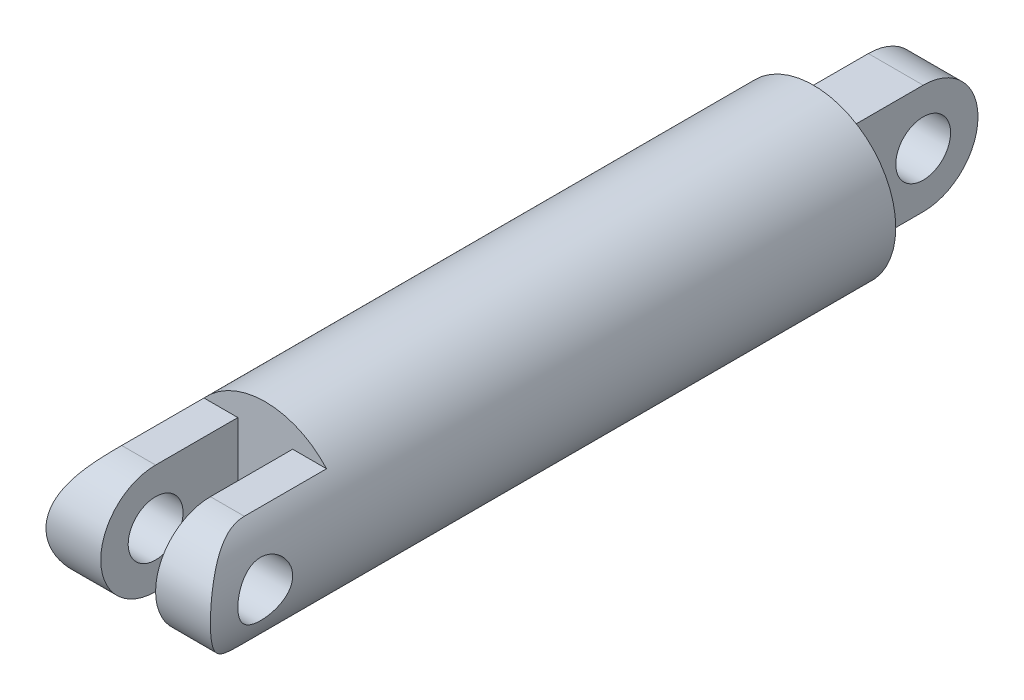
ISO-10303-21;
HEADER;
FILE_DESCRIPTION(('STEP AP214'),'2;1');
FILE_NAME('part.step','',(''),(''),'','','');
FILE_SCHEMA(('AUTOMOTIVE_DESIGN { 1 0 10303 214 1 1 1 1 }'));
ENDSEC;
DATA;
#1=APPLICATION_CONTEXT('core data for automotive mechanical design processes');
#2=APPLICATION_PROTOCOL_DEFINITION('international standard','automotive_design',2000,#1);
#3=PRODUCT_CONTEXT('',#1,'mechanical');
#4=PRODUCT('Part','Part','',(#3));
#5=PRODUCT_RELATED_PRODUCT_CATEGORY('part','',(#4));
#6=PRODUCT_DEFINITION_FORMATION('','',#4);
#7=PRODUCT_DEFINITION_CONTEXT('part definition',#1,'design');
#8=PRODUCT_DEFINITION('design','',#6,#7);
#9=PRODUCT_DEFINITION_SHAPE('','',#8);
#10=(LENGTH_UNIT() NAMED_UNIT(*) SI_UNIT(.MILLI.,.METRE.));
#11=(NAMED_UNIT(*) PLANE_ANGLE_UNIT() SI_UNIT($,.RADIAN.));
#12=(NAMED_UNIT(*) SI_UNIT($,.STERADIAN.) SOLID_ANGLE_UNIT());
#13=UNCERTAINTY_MEASURE_WITH_UNIT(LENGTH_MEASURE(1.E-05),#10,'distance_accuracy_value','');
#14=(GEOMETRIC_REPRESENTATION_CONTEXT(3) GLOBAL_UNCERTAINTY_ASSIGNED_CONTEXT((#13)) GLOBAL_UNIT_ASSIGNED_CONTEXT((#10,
#11,#12)) REPRESENTATION_CONTEXT('',''));
#15=CARTESIAN_POINT('',(0.,0.,0.));
#16=DIRECTION('',(0.,0.,1.));
#17=DIRECTION('',(1.,0.,0.));
#18=AXIS2_PLACEMENT_3D('',#15,#16,#17);
#19=CARTESIAN_POINT('',(-7.5,5.00000000000001,0.));
#20=DIRECTION('',(0.,1.,0.));
#21=DIRECTION('',(0.,0.,1.));
#22=AXIS2_PLACEMENT_3D('',#19,#20,#21);
#23=PLANE('',#22);
#24=DIRECTION('',(0.,0.,-1.));
#25=VECTOR('',#24,1.);
#26=CARTESIAN_POINT('',(-5.59016994374948,5.,62.5));
#27=LINE('',#26,#25);
#28=CARTESIAN_POINT('',(-5.59016994374948,5.,57.5));
#29=VERTEX_POINT('',#28);
#30=CARTESIAN_POINT('',(-5.59016994374947,5.,50.));
#31=VERTEX_POINT('',#30);
#32=EDGE_CURVE('E199',#29,#31,#27,.T.);
#33=ORIENTED_EDGE('',*,*,#32,.F.);
#34=DIRECTION('',(1.,0.,0.));
#35=VECTOR('',#34,1.);
#36=CARTESIAN_POINT('',(-7.5,5.,57.5));
#37=LINE('',#36,#35);
#38=CARTESIAN_POINT('',(-2.5,5.,57.5));
#39=VERTEX_POINT('',#38);
#40=EDGE_CURVE('E238',#29,#39,#37,.T.);
#41=ORIENTED_EDGE('',*,*,#40,.T.);
#42=DIRECTION('',(0.,0.,-1.));
#43=VECTOR('',#42,1.);
#44=CARTESIAN_POINT('',(-2.5,5.,62.5));
#45=LINE('',#44,#43);
#46=CARTESIAN_POINT('',(-2.5,5.,50.));
#47=VERTEX_POINT('',#46);
#48=EDGE_CURVE('E388',#39,#47,#45,.T.);
#49=ORIENTED_EDGE('',*,*,#48,.T.);
#50=DIRECTION('',(1.,0.,0.));
#51=VECTOR('',#50,1.);
#52=CARTESIAN_POINT('',(-7.5,5.,50.));
#53=LINE('',#52,#51);
#54=EDGE_CURVE('E211',#31,#47,#53,.T.);
#55=ORIENTED_EDGE('',*,*,#54,.F.);
#56=EDGE_LOOP('',(#33,#41,#49,#55));
#57=FACE_BOUND('',#56,.T.);
#58=ADVANCED_FACE('F100',(#57),#23,.T.);
#59=CARTESIAN_POINT('',(-7.5,-4.99999999999999,0.));
#60=DIRECTION('',(0.,1.,0.));
#61=DIRECTION('',(0.,0.,1.));
#62=AXIS2_PLACEMENT_3D('',#59,#60,#61);
#63=PLANE('',#62);
#64=DIRECTION('',(1.,0.,0.));
#65=VECTOR('',#64,1.);
#66=CARTESIAN_POINT('',(-7.5,-5.,57.5));
#67=LINE('',#66,#65);
#68=CARTESIAN_POINT('',(-5.59016994374947,-5.,57.5));
#69=VERTEX_POINT('',#68);
#70=CARTESIAN_POINT('',(-2.5,-5.,57.5));
#71=VERTEX_POINT('',#70);
#72=EDGE_CURVE('E234',#69,#71,#67,.T.);
#73=ORIENTED_EDGE('',*,*,#72,.F.);
#74=DIRECTION('',(0.,0.,-1.));
#75=VECTOR('',#74,1.);
#76=CARTESIAN_POINT('',(-5.59016994374947,-5.,62.5));
#77=LINE('',#76,#75);
#78=CARTESIAN_POINT('',(-5.59016994374947,-5.,50.));
#79=VERTEX_POINT('',#78);
#80=EDGE_CURVE('E422',#69,#79,#77,.T.);
#81=ORIENTED_EDGE('',*,*,#80,.T.);
#82=DIRECTION('',(1.,0.,0.));
#83=VECTOR('',#82,1.);
#84=CARTESIAN_POINT('',(-7.5,-5.,50.));
#85=LINE('',#84,#83);
#86=CARTESIAN_POINT('',(-2.5,-5.,50.));
#87=VERTEX_POINT('',#86);
#88=EDGE_CURVE('E212',#79,#87,#85,.T.);
#89=ORIENTED_EDGE('',*,*,#88,.T.);
#90=DIRECTION('',(0.,0.,-1.));
#91=VECTOR('',#90,1.);
#92=CARTESIAN_POINT('',(-2.5,-5.,62.5));
#93=LINE('',#92,#91);
#94=EDGE_CURVE('E385',#71,#87,#93,.T.);
#95=ORIENTED_EDGE('',*,*,#94,.F.);
#96=EDGE_LOOP('',(#73,#81,#89,#95));
#97=FACE_BOUND('',#96,.T.);
#98=ADVANCED_FACE('F292',(#97),#63,.F.);
#99=CARTESIAN_POINT('',(-7.5,0.,57.5));
#100=DIRECTION('',(1.,0.,0.));
#101=DIRECTION('',(0.,0.,-1.));
#102=AXIS2_PLACEMENT_3D('',#99,#100,#101);
#103=CYLINDRICAL_SURFACE('',#102,2.50000000000001);
#104=CARTESIAN_POINT('',(-7.5,0.,55.));
#105=CARTESIAN_POINT('',(-7.5000003825236,-0.13640840721681,54.9999993656709));
#106=CARTESIAN_POINT('',(-7.49624423768862,-0.272812986346377,55.011200665318));
#107=CARTESIAN_POINT('',(-7.48163025508202,-0.541604402182434,55.055572772043));
#108=CARTESIAN_POINT('',(-7.47077168005381,-0.673990820297049,55.0887458598723));
#109=CARTESIAN_POINT('',(-7.44313269766106,-0.930831973754445,55.1757981084601));
#110=CARTESIAN_POINT('',(-7.42636219327133,-1.05529956471509,55.2296426561482));
#111=CARTESIAN_POINT('',(-7.38861114293354,-1.29343734201332,55.3563529320959));
#112=CARTESIAN_POINT('',(-7.36762976669445,-1.40710539239677,55.4292224125065));
#113=CARTESIAN_POINT('',(-7.32285236107512,-1.62435418755567,55.5945645121469));
#114=CARTESIAN_POINT('',(-7.29898891159462,-1.72750925074578,55.6875780856512));
#115=CARTESIAN_POINT('',(-7.25150786957803,-1.91708173175522,55.8894178867664));
#116=CARTESIAN_POINT('',(-7.22789033226372,-2.00349546372367,55.9982475873213));
#117=CARTESIAN_POINT('',(-7.18283331193184,-2.15956235556966,56.2324627879911));
#118=CARTESIAN_POINT('',(-7.1614759818922,-2.22866214555259,56.3582343493303));
#119=CARTESIAN_POINT('',(-7.12438263546503,-2.34454718469431,56.6204402361464));
#120=CARTESIAN_POINT('',(-7.10864490401864,-2.39133924346692,56.7568712929069));
#121=CARTESIAN_POINT('',(-7.08528258173443,-2.45968365377292,57.0316830537418));
#122=CARTESIAN_POINT('',(-7.07740239424028,-2.48203362067943,57.1698430212227));
#123=CARTESIAN_POINT('',(-7.06989141573768,-2.5033528083362,57.4481593853897));
#124=CARTESIAN_POINT('',(-7.07025807556824,-2.50232925401181,57.588315151773));
#125=CARTESIAN_POINT('',(-7.0789753752045,-2.47754975925856,57.8598415761101));
#126=CARTESIAN_POINT('',(-7.08696039668832,-2.4548347829175,57.9913210072976));
#127=CARTESIAN_POINT('',(-7.10941644311377,-2.38901540712355,58.2484835490171));
#128=CARTESIAN_POINT('',(-7.12388824460269,-2.34590856647969,58.3741659635877));
#129=CARTESIAN_POINT('',(-7.15794777828122,-2.23984764515054,58.6185318739787));
#130=CARTESIAN_POINT('',(-7.17761414482793,-2.17658512176817,58.7370700636738));
#131=CARTESIAN_POINT('',(-7.21981396439315,-2.03222276575786,58.9621772706993));
#132=CARTESIAN_POINT('',(-7.24234824476158,-1.95111778091003,59.0687428173335));
#133=CARTESIAN_POINT('',(-7.28918322919352,-1.76837333170561,59.2727289954019));
#134=CARTESIAN_POINT('',(-7.31351473387107,-1.6658828751908,59.3693817362727));
#135=CARTESIAN_POINT('',(-7.36017345967591,-1.44584892492518,59.5443281666585));
#136=CARTESIAN_POINT('',(-7.38250048845168,-1.32830398915205,59.6226200954112));
#137=CARTESIAN_POINT('',(-7.42292769844484,-1.07986903261568,59.7592407505877));
#138=CARTESIAN_POINT('',(-7.44098375020098,-0.948858191040853,59.8173637283518));
#139=CARTESIAN_POINT('',(-7.47051417861087,-0.67817270841128,59.9105079348893));
#140=CARTESIAN_POINT('',(-7.48199084137198,-0.538501095387393,59.9455371885586));
#141=CARTESIAN_POINT('',(-7.49669067678601,-0.260959573823266,59.9901391650559));
#142=CARTESIAN_POINT('',(-7.5002500458432,-0.123273999662121,60.0007495229319));
#143=CARTESIAN_POINT('',(-7.49972256737068,0.151937674900589,59.9991683160038));
#144=CARTESIAN_POINT('',(-7.49563701048406,0.289463798299123,59.9869806000503));
#145=CARTESIAN_POINT('',(-7.48050061792761,0.556299665760638,59.9409702306601));
#146=CARTESIAN_POINT('',(-7.46965496777981,0.685732017087109,59.9077844848763));
#147=CARTESIAN_POINT('',(-7.44229617075175,0.937139896448934,59.8215163888332));
#148=CARTESIAN_POINT('',(-7.42578230116688,1.05911447127152,59.7684315013305));
#149=CARTESIAN_POINT('',(-7.38822328218224,1.29572074098318,59.642323920398));
#150=CARTESIAN_POINT('',(-7.36707036889465,1.41007489804287,59.5688135167921));
#151=CARTESIAN_POINT('',(-7.32263134790656,1.62516207533897,59.4045146249663));
#152=CARTESIAN_POINT('',(-7.29934458984569,1.72589091948894,59.3137208599206));
#153=CARTESIAN_POINT('',(-7.25192119951112,1.91563126951575,59.1125531224835));
#154=CARTESIAN_POINT('',(-7.2277940271857,2.00390242311443,59.0014769326828));
#155=CARTESIAN_POINT('',(-7.18249933236772,2.16064380580894,58.7655710804728));
#156=CARTESIAN_POINT('',(-7.16133183455005,2.22911386982754,58.6407413034148));
#157=CARTESIAN_POINT('',(-7.12455979478459,2.34399232604091,58.3808174617753));
#158=CARTESIAN_POINT('',(-7.10894401982447,2.39044533041256,58.2457448020781));
#159=CARTESIAN_POINT('',(-7.08527080766124,2.4597366668984,57.9690533748897));
#160=CARTESIAN_POINT('',(-7.07720996559098,2.48258563738486,57.8274375864891));
#161=CARTESIAN_POINT('',(-7.06994647185443,2.50319070619336,57.5495072598977));
#162=CARTESIAN_POINT('',(-7.07031000643537,2.50217564327101,57.4132941492829));
#163=CARTESIAN_POINT('',(-7.07878174559668,2.47810573362174,57.1430873126948));
#164=CARTESIAN_POINT('',(-7.08688948923404,2.45505219864647,57.0090934551123));
#165=CARTESIAN_POINT('',(-7.10961310762229,2.38842953282337,56.7496608424938));
#166=CARTESIAN_POINT('',(-7.12410245056194,2.34525836503879,56.6241079374888));
#167=CARTESIAN_POINT('',(-7.15790997046171,2.23994841439937,56.3819314826543));
#168=CARTESIAN_POINT('',(-7.17722921908483,2.17780542138452,56.26530992203));
#169=CARTESIAN_POINT('',(-7.21957073065115,2.03315173145858,56.0387908251927));
#170=CARTESIAN_POINT('',(-7.24271779105342,1.94987060691146,55.929408745254));
#171=CARTESIAN_POINT('',(-7.28958390708132,1.76660720783913,55.7257754665395));
#172=CARTESIAN_POINT('',(-7.3133031228093,1.66662021112872,55.6315285607798));
#173=CARTESIAN_POINT('',(-7.3597507631386,1.44810389230173,55.4571389692771));
#174=CARTESIAN_POINT('',(-7.38240454503141,1.32900378374932,55.3776891306225));
#175=CARTESIAN_POINT('',(-7.4231497793153,1.07839339351656,55.2400239278734));
#176=CARTESIAN_POINT('',(-7.44124239769824,0.946886295330871,55.1818031351949));
#177=CARTESIAN_POINT('',(-7.47013787671355,0.681234118002439,55.0906959187783));
#178=CARTESIAN_POINT('',(-7.48123031056307,0.547469394191021,55.0567938343416));
#179=CARTESIAN_POINT('',(-7.49616017660554,0.275801040025616,55.0114492983072));
#180=CARTESIAN_POINT('',(-7.49999961329762,0.137898563921864,55.0000006412587));
#181=CARTESIAN_POINT('',(-7.5,0.,55.));
#182=B_SPLINE_CURVE_WITH_KNOTS('',3,(#104,#105,#106,#107,#108,#109,#110,#111,#112,#113,#114,
#115,#116,#117,#118,#119,#120,#121,#122,#123,#124,#125,#126,#127,#128,#129,#130,#131,#132,#133,
#134,#135,#136,#137,#138,#139,#140,#141,#142,#143,#144,#145,#146,#147,#148,#149,#150,#151,#152,
#153,#154,#155,#156,#157,#158,#159,#160,#161,#162,#163,#164,#165,#166,#167,#168,#169,#170,#171,
#172,#173,#174,#175,#176,#177,#178,#179,#180,#181),.UNSPECIFIED.,.T.,.F.,(4,2,2,2,2,2,2,2,2,2,2,
2,2,2,2,2,2,2,2,2,2,2,2,2,2,2,2,2,2,2,2,2,2,2,2,2,2,2,4),(0.,0.408717765065028,
0.817477963168803,1.22555668217569,1.63371594449776,2.05461710706891,2.47561083218827,
2.90870962058677,3.34167611732084,3.76004814354601,4.17829084968715,4.57742066378203,
4.97659827138706,5.38220427887828,5.78792756395519,6.21483264528417,6.64177864916548,
7.07296014125896,7.50399172193023,7.91633957937926,8.32861782910444,8.72895394945537,
9.12934113210263,9.54025999609345,9.95130452054731,10.3810255720188,10.810750205875,
11.2396003456693,11.668257117646,12.0748916516065,12.4815019837844,12.8803896770105,
13.2793659543995,13.6957516672952,14.1122552780945,14.5449915208776,14.9776170288115,
15.3909139593454,15.8040966509536),.UNSPECIFIED.);
#183=CARTESIAN_POINT('',(-7.5,0.,55.));
#184=VERTEX_POINT('',#183);
#185=EDGE_CURVE('E362',#184,#184,#182,.T.);
#186=ORIENTED_EDGE('',*,*,#185,.T.);
#187=EDGE_LOOP('',(#186));
#188=FACE_BOUND('',#187,.T.);
#189=CARTESIAN_POINT('',(-2.5,0.,57.5));
#190=DIRECTION('',(1.,0.,0.));
#191=DIRECTION('',(0.,1.,0.));
#192=AXIS2_PLACEMENT_3D('',#189,#190,#191);
#193=CIRCLE('',#192,2.50000000000001);
#194=CARTESIAN_POINT('',(-2.5,2.50000000000001,57.5));
#195=VERTEX_POINT('',#194);
#196=EDGE_CURVE('E231',#195,#195,#193,.F.);
#197=ORIENTED_EDGE('',*,*,#196,.F.);
#198=EDGE_LOOP('',(#197));
#199=FACE_BOUND('',#198,.T.);
#200=ADVANCED_FACE('F298',(#188,#199),#103,.F.);
#201=CARTESIAN_POINT('',(-7.5,0.,57.5));
#202=DIRECTION('',(1.,0.,0.));
#203=DIRECTION('',(0.,0.,-1.));
#204=AXIS2_PLACEMENT_3D('',#201,#202,#203);
#205=CYLINDRICAL_SURFACE('',#204,5.);
#206=CARTESIAN_POINT('',(-5.59016994374947,-5.,57.5));
#207=CARTESIAN_POINT('',(-5.59010226361799,-5.00003201559916,57.6229128319572));
#208=CARTESIAN_POINT('',(-5.59422195484826,-4.99546916272249,57.7457835039495));
#209=CARTESIAN_POINT('',(-5.61031529203818,-4.97741130258459,57.9901889706824));
#210=CARTESIAN_POINT('',(-5.62227841275833,-4.96392826525997,58.1117253340456));
#211=CARTESIAN_POINT('',(-5.65338604571233,-4.92846233533554,58.3513567436878));
#212=CARTESIAN_POINT('',(-5.67245848399497,-4.90656468311768,58.4694739200321));
#213=CARTESIAN_POINT('',(-5.7169359163873,-4.85466962385897,58.7026920062733));
#214=CARTESIAN_POINT('',(-5.74234275220442,-4.82466986094175,58.8177920281665));
#215=CARTESIAN_POINT('',(-5.82632128684178,-4.72351818053447,59.1563803841529));
#216=CARTESIAN_POINT('',(-5.89285893571061,-4.64099224020302,59.3746007478263));
#217=CARTESIAN_POINT('',(-6.03939263101204,-4.44863770598509,59.7941675176117));
#218=CARTESIAN_POINT('',(-6.11942668598134,-4.33873157480712,59.9954637936456));
#219=CARTESIAN_POINT('',(-6.29868579922378,-4.07500623960727,60.4091852347824));
#220=CARTESIAN_POINT('',(-6.39896579342898,-3.91702659837082,60.6185281312344));
#221=CARTESIAN_POINT('',(-6.54873658541254,-3.65706476808987,60.9121827044888));
#222=CARTESIAN_POINT('',(-6.59857754919796,-3.56652606748559,61.0067178110933));
#223=CARTESIAN_POINT('',(-6.69707992879728,-3.37793159469755,61.1887326804366));
#224=CARTESIAN_POINT('',(-6.74574111230676,-3.27987435764812,61.2762110614383));
#225=CARTESIAN_POINT('',(-6.84779398342079,-3.06173982813814,61.4558194920628));
#226=CARTESIAN_POINT('',(-6.90084497500896,-2.94053369616544,61.5467770351006));
#227=CARTESIAN_POINT('',(-7.00262930329851,-2.68915572684724,61.7180034828374));
#228=CARTESIAN_POINT('',(-7.05136448408698,-2.55898776144359,61.7982769601382));
#229=CARTESIAN_POINT('',(-7.14313102894779,-2.29037273054282,61.9472191864513));
#230=CARTESIAN_POINT('',(-7.18616630635346,-2.15193144095229,62.0158959063485));
#231=CARTESIAN_POINT('',(-7.26524703275327,-1.86760242661746,62.1407054007236));
#232=CARTESIAN_POINT('',(-7.301294394784,-1.72171675372871,62.1968416089797));
#233=CARTESIAN_POINT('',(-7.36005121285871,-1.44775400626075,62.2876242904999));
#234=CARTESIAN_POINT('',(-7.38397414568696,-1.32059901489015,62.3242764081429));
#235=CARTESIAN_POINT('',(-7.42546096608191,-1.06280856138209,62.3875395048978));
#236=CARTESIAN_POINT('',(-7.44302609052533,-0.932173781533196,62.4141524371205));
#237=CARTESIAN_POINT('',(-7.47131644326015,-0.668571926042403,62.4568968080757));
#238=CARTESIAN_POINT('',(-7.48204706115876,-0.535606773344601,62.4730365060606));
#239=CARTESIAN_POINT('',(-7.49638849316886,-0.268425779014243,62.494587666984));
#240=CARTESIAN_POINT('',(-7.49999959021819,-0.134209987296497,62.499999556258));
#241=CARTESIAN_POINT('',(-7.50000038348696,0.125598011271417,62.500000415268));
#242=CARTESIAN_POINT('',(-7.49683859322069,0.251190939137055,62.4952615856888));
#243=CARTESIAN_POINT('',(-7.48426981875016,0.501398424402497,62.4763786631053));
#244=CARTESIAN_POINT('',(-7.47486055383152,0.626012607683884,62.4622311353418));
#245=CARTESIAN_POINT('',(-7.45002835224819,0.873217578657856,62.424745594317));
#246=CARTESIAN_POINT('',(-7.43460628603808,0.995808656552775,62.4014089113364));
#247=CARTESIAN_POINT('',(-7.39810821970811,1.23815204074688,62.3458686372065));
#248=CARTESIAN_POINT('',(-7.37702981954413,1.3579031184732,62.313661281981));
#249=CARTESIAN_POINT('',(-7.32981543670939,1.59314805421769,62.2409866655272));
#250=CARTESIAN_POINT('',(-7.30370586592719,1.70866054959293,62.2005624815031));
#251=CARTESIAN_POINT('',(-7.24690745085558,1.93546515133163,62.1118135788698));
#252=CARTESIAN_POINT('',(-7.21621682334522,2.04675559296785,62.0634857829988));
#253=CARTESIAN_POINT('',(-7.11817940386788,2.3734106060806,61.9073892515922));
#254=CARTESIAN_POINT('',(-7.04482545719646,2.58175844053806,61.7884447379015));
#255=CARTESIAN_POINT('',(-6.8806780561988,2.99324792707627,61.5133461626331));
#256=CARTESIAN_POINT('',(-6.78893289097235,3.1944471625288,61.354890934673));
#257=CARTESIAN_POINT('',(-6.59954115495232,3.56933599975951,61.010652999138));
#258=CARTESIAN_POINT('',(-6.50188643365823,3.74298635364909,60.8248320180691));
#259=CARTESIAN_POINT('',(-6.34920531525177,3.99364730435712,60.5120388092103));
#260=CARTESIAN_POINT('',(-6.29353108665728,4.08057745182287,60.3932023698115));
#261=CARTESIAN_POINT('',(-6.18446883282753,4.24405575434584,60.1475991963711));
#262=CARTESIAN_POINT('',(-6.13108134934901,4.32060145841404,60.0208306004227));
#263=CARTESIAN_POINT('',(-5.97718524795149,4.53362867574809,59.6293787287551));
#264=CARTESIAN_POINT('',(-5.88265325211255,4.65395289499761,59.3529883676076));
#265=CARTESIAN_POINT('',(-5.7489446861421,4.81742525619265,58.8564514499051));
#266=CARTESIAN_POINT('',(-5.70167352841641,4.87277745975599,58.6425223787687));
#267=CARTESIAN_POINT('',(-5.64825621036596,4.93435877253254,58.3151302386967));
#268=CARTESIAN_POINT('',(-5.63337185075142,4.95130477197473,58.2050358886755));
#269=CARTESIAN_POINT('',(-5.60994599745737,4.97783435274302,57.9833227586418));
#270=CARTESIAN_POINT('',(-5.60140045262999,4.98742263653384,57.8717049987824));
#271=CARTESIAN_POINT('',(-5.59419461342581,4.99549713342325,57.7165365389982));
#272=CARTESIAN_POINT('',(-5.59268623376651,4.9971854695902,57.6732518929225));
#273=CARTESIAN_POINT('',(-5.5906740558166,4.99943659388596,57.5866467828403));
#274=CARTESIAN_POINT('',(-5.5901698695008,4.99999981676426,57.5433263391419));
#275=CARTESIAN_POINT('',(-5.59016994374948,5.,57.5));
#276=B_SPLINE_CURVE_WITH_KNOTS('',3,(#206,#207,#208,#209,#210,#211,#212,#213,#214,#215,#216,
#217,#218,#219,#220,#221,#222,#223,#224,#225,#226,#227,#228,#229,#230,#231,#232,#233,#234,#235,
#236,#237,#238,#239,#240,#241,#242,#243,#244,#245,#246,#247,#248,#249,#250,#251,#252,#253,#254,
#255,#256,#257,#258,#259,#260,#261,#262,#263,#264,#265,#266,#267,#268,#269,#270,#271,#272,#273,
#274,#275),.UNSPECIFIED.,.F.,.F.,(4,2,2,2,2,2,2,2,2,2,2,2,2,2,2,2,2,2,2,2,2,2,2,2,2,2,2,2,2,2,2,
2,2,2,4),(0.,0.368516864311458,0.736540218576852,1.10092978285455,1.46542541612836,
2.19004710441291,2.91674463344916,3.75566981477297,4.17556623857454,4.59554468133307,
5.07657717444378,5.55740312708243,6.03789723281714,6.51825961043194,6.92115592840717,
7.32397382293358,7.72647366566694,8.12895751227685,8.50561480672542,8.88240968002327,
9.25915002614016,9.63605048074902,10.0110237417354,10.3861433472097,11.1357498247009,
11.9489727394519,12.7633440160795,13.2350651665194,13.7068974619908,14.6482604078241,
15.3232302822239,15.6600060261307,15.9965663501729,16.1265773111982,16.2565380256032),.UNSPECIFIED.);
#277=EDGE_CURVE('E357',#69,#29,#276,.T.);
#278=ORIENTED_EDGE('',*,*,#277,.F.);
#279=ORIENTED_EDGE('',*,*,#72,.T.);
#280=CARTESIAN_POINT('',(-2.5,0.,57.5));
#281=DIRECTION('',(1.,0.,0.));
#282=DIRECTION('',(0.,1.,0.));
#283=AXIS2_PLACEMENT_3D('',#280,#281,#282);
#284=CIRCLE('',#283,5.);
#285=EDGE_CURVE('E12',#71,#39,#284,.F.);
#286=ORIENTED_EDGE('',*,*,#285,.T.);
#287=ORIENTED_EDGE('',*,*,#40,.F.);
#288=EDGE_LOOP('',(#278,#279,#286,#287));
#289=FACE_BOUND('',#288,.T.);
#290=ADVANCED_FACE('F340',(#289),#205,.T.);
#291=CARTESIAN_POINT('',(5.59016994374948,5.,57.5));
#292=CARTESIAN_POINT('',(5.59010226445732,5.00003201517393,57.622912460547));
#293=CARTESIAN_POINT('',(5.59422193038262,4.99546919008054,57.7457827613626));
#294=CARTESIAN_POINT('',(5.61031517101094,4.97741143868822,57.9901874982554));
#295=CARTESIAN_POINT('',(5.62227822063732,4.96392848213943,58.1117235029259));
#296=CARTESIAN_POINT('',(5.65338576619382,4.92846265601991,58.3513549396555));
#297=CARTESIAN_POINT('',(5.67245823203861,4.90656497492185,58.4694724882314));
#298=CARTESIAN_POINT('',(5.71693576125672,4.85466980704325,58.7026913035797));
#299=CARTESIAN_POINT('',(5.74234266641994,4.82466996428155,58.8177916823098));
#300=CARTESIAN_POINT('',(5.82632124311297,4.72351823318001,59.1563802078195));
#301=CARTESIAN_POINT('',(5.89285883142751,4.64099236942275,59.3746004058546));
#302=CARTESIAN_POINT('',(6.03939250499645,4.44863787909013,59.7941672005125));
#303=CARTESIAN_POINT('',(6.11942661962652,4.33873167274042,59.9954636395924));
#304=CARTESIAN_POINT('',(6.29868730837299,4.07500401899203,60.4091887188764));
#305=CARTESIAN_POINT('',(6.39896894668939,3.9170216297286,60.6185347191776));
#306=CARTESIAN_POINT('',(6.54874052957501,3.65705766842246,60.9121902361376));
#307=CARTESIAN_POINT('',(6.59858071272888,3.56652016600152,61.0067237355512));
#308=CARTESIAN_POINT('',(6.69708150444303,3.37792842268575,61.1887355129615));
#309=CARTESIAN_POINT('',(6.74574188183287,3.2798727240983,61.2762124159831));
#310=CARTESIAN_POINT('',(6.8477870780144,3.0617545752834,61.4558073386156));
#311=CARTESIAN_POINT('',(6.90083152907612,2.94056436511528,61.5467539806611));
#312=CARTESIAN_POINT('',(7.0026042051056,2.68922024819486,61.7179616960362));
#313=CARTESIAN_POINT('',(7.0513342575425,2.55907017853796,61.7982273008976));
#314=CARTESIAN_POINT('',(7.1431024211524,2.29046251931499,61.9471733546342));
#315=CARTESIAN_POINT('',(7.18614320859165,2.15200888067943,62.015859254894));
#316=CARTESIAN_POINT('',(7.26523573466908,1.86764864764788,62.1406877668306));
#317=CARTESIAN_POINT('',(7.30128897098523,1.72174365882795,62.1968330667933));
#318=CARTESIAN_POINT('',(7.3616269212467,1.44040558765596,62.290058995005));
#319=CARTESIAN_POINT('',(7.38677785041693,1.30563224903165,62.3285712695995));
#320=CARTESIAN_POINT('',(7.42991277845054,1.03224687814789,62.3943049093148));
#321=CARTESIAN_POINT('',(7.44789818123794,0.893635603543305,62.4215284862451));
#322=CARTESIAN_POINT('',(7.47614707065181,0.613969581475909,62.4641746575667));
#323=CARTESIAN_POINT('',(7.48641820157216,0.472917394995508,62.479608934573));
#324=CARTESIAN_POINT('',(7.49894085913111,0.189663788364084,62.4984162296433));
#325=CARTESIAN_POINT('',(7.50119351729107,0.0474625332018543,62.5017909494837));
#326=CARTESIAN_POINT('',(7.49788711574803,-0.214926346569336,62.496830020676));
#327=CARTESIAN_POINT('',(7.4934665190527,-0.335165287104258,62.4902010668775));
#328=CARTESIAN_POINT('',(7.47892220337967,-0.574546724821544,62.4683341695846));
#329=CARTESIAN_POINT('',(7.46879681536646,-0.693688890751088,62.4530937066402));
#330=CARTESIAN_POINT('',(7.44307060770358,-0.929952068596904,62.41421545244));
#331=CARTESIAN_POINT('',(7.4274716519369,-1.04707375430986,62.3905805196721));
#332=CARTESIAN_POINT('',(7.39114067829175,-1.27859359703581,62.3352238886201));
#333=CARTESIAN_POINT('',(7.3704066699432,-1.39299067903352,62.3034990543537));
#334=CARTESIAN_POINT('',(7.30131486800451,-1.73005536090665,62.1970368204148));
#335=CARTESIAN_POINT('',(7.24593119108564,-1.94778788254665,62.1108108780934));
#336=CARTESIAN_POINT('',(7.12052339554367,-2.36556147420187,61.9111078414692));
#337=CARTESIAN_POINT('',(7.05049660175356,-2.56559930203851,61.7976257671501));
#338=CARTESIAN_POINT('',(6.89045516040976,-2.97069678505628,61.5300582038286));
#339=CARTESIAN_POINT('',(6.79902315170023,-3.17296135211842,61.3725965512661));
#340=CARTESIAN_POINT('',(6.60999664050786,-3.54999843902834,61.0302280428355));
#341=CARTESIAN_POINT('',(6.51239293717769,-3.72472848819274,60.8452796273609));
#342=CARTESIAN_POINT('',(6.35968320603837,-3.97694874366429,60.534037396458));
#343=CARTESIAN_POINT('',(6.30402476438211,-4.06435760393837,60.4159275647113));
#344=CARTESIAN_POINT('',(6.19487641908603,-4.22886066252285,60.1717849187943));
#345=CARTESIAN_POINT('',(6.14138702460645,-4.30595244866985,60.0457502618648));
#346=CARTESIAN_POINT('',(5.98697032359011,-4.52074303081129,59.6565033029641));
#347=CARTESIAN_POINT('',(5.89181010067388,-4.64240418228592,59.3815997545078));
#348=CARTESIAN_POINT('',(5.75614663097742,-4.80884917205035,58.8865984083301));
#349=CARTESIAN_POINT('',(5.70780007382718,-4.8656199042536,58.6727015563252));
#350=CARTESIAN_POINT('',(5.65266631753014,-4.92931127660652,58.3451417833851));
#351=CARTESIAN_POINT('',(5.63719320237259,-4.94695700785962,58.2349547615092));
#352=CARTESIAN_POINT('',(5.61257721152858,-4.97487072846233,58.0129772887609));
#353=CARTESIAN_POINT('',(5.6034303802061,-4.98514332816252,57.9011878845304));
#354=CARTESIAN_POINT('',(5.59515338026079,-4.99442370748282,57.7409520259264));
#355=CARTESIAN_POINT('',(5.59328601743422,-4.99651432568549,57.6927963539451));
#356=CARTESIAN_POINT('',(5.59079425464031,-4.99930222265414,57.5964293939127));
#357=CARTESIAN_POINT('',(5.59016942249225,-4.9999999858874,57.5482181310375));
#358=CARTESIAN_POINT('',(5.59016994374947,-5.,57.5));
#359=B_SPLINE_CURVE_WITH_KNOTS('',3,(#291,#292,#293,#294,#295,#296,#297,#298,#299,#300,#301,
#302,#303,#304,#305,#306,#307,#308,#309,#310,#311,#312,#313,#314,#315,#316,#317,#318,#319,#320,
#321,#322,#323,#324,#325,#326,#327,#328,#329,#330,#331,#332,#333,#334,#335,#336,#337,#338,#339,
#340,#341,#342,#343,#344,#345,#346,#347,#348,#349,#350,#351,#352,#353,#354,#355,#356,#357,#358),
.UNSPECIFIED.,.F.,.F.,(4,2,2,2,2,2,2,2,2,2,2,2,2,2,2,2,2,2,2,2,2,2,2,2,2,2,2,2,2,2,2,2,2,4),(0.,
0.36851575171752,0.736537999625394,1.10092867135667,1.46542541646112,2.19004653621929,
2.91674463400917,3.75568298357548,4.1755730100087,4.59554465521631,5.07651617741289,
5.55728298782238,6.03782283148632,6.51825956437982,6.94483626061025,7.37132933756313,
7.79739923062861,8.22340899674542,8.58447831828017,8.94565333179428,9.30670547559305,
9.66789779154569,10.3866775595137,11.1055887570481,11.9189816837108,12.7336172025118,
13.2044776085119,13.6754479114957,14.6151291766078,15.2917554506692,15.6293636463715,
15.9667605544628,16.1114425917876,16.2560742965681),.UNSPECIFIED.);
#360=CARTESIAN_POINT('',(5.59016994374948,5.,57.5));
#361=VERTEX_POINT('',#360);
#362=CARTESIAN_POINT('',(5.59016994374947,-5.,57.5));
#363=VERTEX_POINT('',#362);
#364=EDGE_CURVE('E115',#361,#363,#359,.T.);
#365=ORIENTED_EDGE('',*,*,#364,.F.);
#366=CARTESIAN_POINT('',(2.5,5.,57.5));
#367=VERTEX_POINT('',#366);
#368=EDGE_CURVE('E197',#367,#361,#37,.T.);
#369=ORIENTED_EDGE('',*,*,#368,.F.);
#370=CARTESIAN_POINT('',(2.5,0.,57.5));
#371=DIRECTION('',(1.,0.,0.));
#372=DIRECTION('',(0.,1.,0.));
#373=AXIS2_PLACEMENT_3D('',#370,#371,#372);
#374=CIRCLE('',#373,5.);
#375=CARTESIAN_POINT('',(2.5,-5.,57.5));
#376=VERTEX_POINT('',#375);
#377=EDGE_CURVE('E108',#376,#367,#374,.F.);
#378=ORIENTED_EDGE('',*,*,#377,.F.);
#379=EDGE_CURVE('E237',#376,#363,#67,.T.);
#380=ORIENTED_EDGE('',*,*,#379,.T.);
#381=EDGE_LOOP('',(#365,#369,#378,#380));
#382=FACE_BOUND('',#381,.T.);
#383=ADVANCED_FACE('F335',(#382),#205,.T.);
#384=CARTESIAN_POINT('',(2.5,5.,-12.5));
#385=DIRECTION('',(-1.,0.,0.));
#386=DIRECTION('',(0.,-1.,0.));
#387=AXIS2_PLACEMENT_3D('',#384,#385,#386);
#388=PLANE('',#387);
#389=CARTESIAN_POINT('',(2.5,0.,-7.5));
#390=DIRECTION('',(-1.,0.,0.));
#391=DIRECTION('',(0.,-1.,0.));
#392=AXIS2_PLACEMENT_3D('',#389,#390,#391);
#393=CIRCLE('',#392,2.5);
#394=CARTESIAN_POINT('',(2.5,-2.5,-7.5));
#395=VERTEX_POINT('',#394);
#396=EDGE_CURVE('E242',#395,#395,#393,.T.);
#397=ORIENTED_EDGE('',*,*,#396,.T.);
#398=EDGE_LOOP('',(#397));
#399=FACE_BOUND('',#398,.T.);
#400=CARTESIAN_POINT('',(2.5,0.,-7.5));
#401=DIRECTION('',(-1.,0.,0.));
#402=DIRECTION('',(0.,-1.,0.));
#403=AXIS2_PLACEMENT_3D('',#400,#401,#402);
#404=CIRCLE('',#403,5.);
#405=CARTESIAN_POINT('',(2.5,5.,-7.5));
#406=VERTEX_POINT('',#405);
#407=CARTESIAN_POINT('',(2.5,-5.,-7.5));
#408=VERTEX_POINT('',#407);
#409=EDGE_CURVE('E249',#406,#408,#404,.T.);
#410=ORIENTED_EDGE('',*,*,#409,.F.);
#411=DIRECTION('',(0.,0.,1.));
#412=VECTOR('',#411,1.);
#413=CARTESIAN_POINT('',(2.5,5.,-12.5));
#414=LINE('',#413,#412);
#415=CARTESIAN_POINT('',(2.5,5.,0.));
#416=VERTEX_POINT('',#415);
#417=EDGE_CURVE('E266',#406,#416,#414,.T.);
#418=ORIENTED_EDGE('',*,*,#417,.T.);
#419=DIRECTION('',(0.,-1.,0.));
#420=VECTOR('',#419,1.);
#421=CARTESIAN_POINT('',(2.5,5.,0.));
#422=LINE('',#421,#420);
#423=CARTESIAN_POINT('',(2.5,-5.,0.));
#424=VERTEX_POINT('',#423);
#425=EDGE_CURVE('E255',#416,#424,#422,.T.);
#426=ORIENTED_EDGE('',*,*,#425,.T.);
#427=DIRECTION('',(0.,0.,1.));
#428=VECTOR('',#427,1.);
#429=CARTESIAN_POINT('',(2.5,-5.,-12.5));
#430=LINE('',#429,#428);
#431=EDGE_CURVE('E123',#408,#424,#430,.T.);
#432=ORIENTED_EDGE('',*,*,#431,.F.);
#433=EDGE_LOOP('',(#410,#418,#426,#432));
#434=FACE_BOUND('',#433,.T.);
#435=ADVANCED_FACE('F287',(#399,#434),#388,.F.);
#436=CARTESIAN_POINT('',(-2.5,5.,-12.5));
#437=DIRECTION('',(1.,0.,0.));
#438=DIRECTION('',(0.,1.,0.));
#439=AXIS2_PLACEMENT_3D('',#436,#437,#438);
#440=PLANE('',#439);
#441=CARTESIAN_POINT('',(-2.5,0.,-7.5));
#442=DIRECTION('',(-1.,0.,0.));
#443=DIRECTION('',(0.,-1.,0.));
#444=AXIS2_PLACEMENT_3D('',#441,#442,#443);
#445=CIRCLE('',#444,2.5);
#446=CARTESIAN_POINT('',(-2.5,-2.5,-7.5));
#447=VERTEX_POINT('',#446);
#448=EDGE_CURVE('E243',#447,#447,#445,.T.);
#449=ORIENTED_EDGE('',*,*,#448,.F.);
#450=EDGE_LOOP('',(#449));
#451=FACE_BOUND('',#450,.T.);
#452=DIRECTION('',(0.,0.,1.));
#453=VECTOR('',#452,1.);
#454=CARTESIAN_POINT('',(-2.5,5.,-12.5));
#455=LINE('',#454,#453);
#456=CARTESIAN_POINT('',(-2.5,5.,-7.5));
#457=VERTEX_POINT('',#456);
#458=CARTESIAN_POINT('',(-2.5,5.,0.));
#459=VERTEX_POINT('',#458);
#460=EDGE_CURVE('E268',#457,#459,#455,.T.);
#461=ORIENTED_EDGE('',*,*,#460,.F.);
#462=CARTESIAN_POINT('',(-2.5,0.,-7.5));
#463=DIRECTION('',(-1.,0.,0.));
#464=DIRECTION('',(0.,-1.,0.));
#465=AXIS2_PLACEMENT_3D('',#462,#463,#464);
#466=CIRCLE('',#465,5.);
#467=CARTESIAN_POINT('',(-2.5,-5.,-7.5));
#468=VERTEX_POINT('',#467);
#469=EDGE_CURVE('E246',#457,#468,#466,.T.);
#470=ORIENTED_EDGE('',*,*,#469,.T.);
#471=DIRECTION('',(0.,0.,1.));
#472=VECTOR('',#471,1.);
#473=CARTESIAN_POINT('',(-2.5,-5.,-12.5));
#474=LINE('',#473,#472);
#475=CARTESIAN_POINT('',(-2.5,-5.,0.));
#476=VERTEX_POINT('',#475);
#477=EDGE_CURVE('E269',#468,#476,#474,.T.);
#478=ORIENTED_EDGE('',*,*,#477,.T.);
#479=DIRECTION('',(0.,1.,0.));
#480=VECTOR('',#479,1.);
#481=CARTESIAN_POINT('',(-2.5,5.,0.));
#482=LINE('',#481,#480);
#483=EDGE_CURVE('E260',#476,#459,#482,.T.);
#484=ORIENTED_EDGE('',*,*,#483,.T.);
#485=EDGE_LOOP('',(#461,#470,#478,#484));
#486=FACE_BOUND('',#485,.T.);
#487=ADVANCED_FACE('F274',(#451,#486),#440,.F.);
#488=CARTESIAN_POINT('',(-2.5,-5.,-12.5));
#489=DIRECTION('',(0.,1.,0.));
#490=DIRECTION('',(-1.,0.,0.));
#491=AXIS2_PLACEMENT_3D('',#488,#489,#490);
#492=PLANE('',#491);
#493=DIRECTION('',(-1.,0.,0.));
#494=VECTOR('',#493,1.);
#495=CARTESIAN_POINT('',(2.5,-5.,-7.5));
#496=LINE('',#495,#494);
#497=EDGE_CURVE('E251',#408,#468,#496,.T.);
#498=ORIENTED_EDGE('',*,*,#497,.F.);
#499=ORIENTED_EDGE('',*,*,#431,.T.);
#500=DIRECTION('',(-1.,0.,0.));
#501=VECTOR('',#500,1.);
#502=CARTESIAN_POINT('',(-2.5,-5.,0.));
#503=LINE('',#502,#501);
#504=EDGE_CURVE('E258',#424,#476,#503,.T.);
#505=ORIENTED_EDGE('',*,*,#504,.T.);
#506=ORIENTED_EDGE('',*,*,#477,.F.);
#507=EDGE_LOOP('',(#498,#499,#505,#506));
#508=FACE_BOUND('',#507,.T.);
#509=ADVANCED_FACE('F279',(#508),#492,.F.);
#510=CARTESIAN_POINT('',(0.,0.,0.));
#511=DIRECTION('',(0.,0.,1.));
#512=DIRECTION('',(1.,0.,0.));
#513=AXIS2_PLACEMENT_3D('',#510,#511,#512);
#514=PLANE('',#513);
#515=CARTESIAN_POINT('',(0.,0.,0.));
#516=DIRECTION('',(0.,0.,1.));
#517=DIRECTION('',(1.,0.,0.));
#518=AXIS2_PLACEMENT_3D('',#515,#516,#517);
#519=CIRCLE('',#518,7.5);
#520=CARTESIAN_POINT('',(7.5,0.,0.));
#521=VERTEX_POINT('',#520);
#522=EDGE_CURVE('E222',#521,#521,#519,.T.);
#523=ORIENTED_EDGE('',*,*,#522,.F.);
#524=EDGE_LOOP('',(#523));
#525=FACE_BOUND('',#524,.T.);
#526=ORIENTED_EDGE('',*,*,#425,.F.);
#527=DIRECTION('',(1.,0.,0.));
#528=VECTOR('',#527,1.);
#529=CARTESIAN_POINT('',(-2.5,5.,0.));
#530=LINE('',#529,#528);
#531=EDGE_CURVE('E263',#459,#416,#530,.T.);
#532=ORIENTED_EDGE('',*,*,#531,.F.);
#533=ORIENTED_EDGE('',*,*,#483,.F.);
#534=ORIENTED_EDGE('',*,*,#504,.F.);
#535=EDGE_LOOP('',(#526,#532,#533,#534));
#536=FACE_BOUND('',#535,.T.);
#537=ADVANCED_FACE('F278',(#525,#536),#514,.F.);
#538=CARTESIAN_POINT('',(0.,0.,50.));
#539=DIRECTION('',(0.,0.,-1.));
#540=DIRECTION('',(-1.,0.,0.));
#541=AXIS2_PLACEMENT_3D('',#538,#539,#540);
#542=CYLINDRICAL_SURFACE('',#541,7.5);
#543=CARTESIAN_POINT('',(0.,0.,50.));
#544=DIRECTION('',(0.,0.,1.));
#545=DIRECTION('',(1.,0.,0.));
#546=AXIS2_PLACEMENT_3D('',#543,#544,#545);
#547=CIRCLE('',#546,7.5);
#548=CARTESIAN_POINT('',(5.59016994374948,5.,50.));
#549=VERTEX_POINT('',#548);
#550=EDGE_CURVE('E207',#549,#31,#547,.T.);
#551=ORIENTED_EDGE('',*,*,#550,.F.);
#552=DIRECTION('',(0.,0.,-1.));
#553=VECTOR('',#552,1.);
#554=CARTESIAN_POINT('',(5.59016994374948,5.,62.5));
#555=LINE('',#554,#553);
#556=EDGE_CURVE('E191',#549,#361,#555,.F.);
#557=ORIENTED_EDGE('',*,*,#556,.T.);
#558=ORIENTED_EDGE('',*,*,#364,.T.);
#559=DIRECTION('',(0.,0.,-1.));
#560=VECTOR('',#559,1.);
#561=CARTESIAN_POINT('',(5.59016994374947,-5.,62.5));
#562=LINE('',#561,#560);
#563=CARTESIAN_POINT('',(5.59016994374947,-5.,50.));
#564=VERTEX_POINT('',#563);
#565=EDGE_CURVE('E363',#564,#363,#562,.F.);
#566=ORIENTED_EDGE('',*,*,#565,.F.);
#567=EDGE_CURVE('E217',#79,#564,#547,.T.);
#568=ORIENTED_EDGE('',*,*,#567,.F.);
#569=ORIENTED_EDGE('',*,*,#80,.F.);
#570=ORIENTED_EDGE('',*,*,#277,.T.);
#571=ORIENTED_EDGE('',*,*,#32,.T.);
#572=EDGE_LOOP('',(#551,#557,#558,#566,#568,#569,#570,#571));
#573=FACE_BOUND('',#572,.T.);
#574=ORIENTED_EDGE('',*,*,#522,.T.);
#575=EDGE_LOOP('',(#574));
#576=FACE_BOUND('',#575,.T.);
#577=CARTESIAN_POINT('',(7.5,0.,55.));
#578=CARTESIAN_POINT('',(7.5000003825236,0.136408407216808,54.9999993656709));
#579=CARTESIAN_POINT('',(7.49624423768862,0.272812986346375,55.011200665318));
#580=CARTESIAN_POINT('',(7.48163025508202,0.541604402182432,55.055572772043));
#581=CARTESIAN_POINT('',(7.47077168005381,0.673990820297047,55.0887458598723));
#582=CARTESIAN_POINT('',(7.44313269766106,0.930831973754443,55.1757981084601));
#583=CARTESIAN_POINT('',(7.42636219327133,1.05529956471509,55.2296426561482));
#584=CARTESIAN_POINT('',(7.38861114293354,1.29343734201331,55.3563529320959));
#585=CARTESIAN_POINT('',(7.36762976669445,1.40710539239677,55.4292224125065));
#586=CARTESIAN_POINT('',(7.32285236107512,1.62435418755567,55.5945645121469));
#587=CARTESIAN_POINT('',(7.29898891159462,1.72750925074578,55.6875780856512));
#588=CARTESIAN_POINT('',(7.25150786957803,1.91708173175522,55.8894178867664));
#589=CARTESIAN_POINT('',(7.22789033226372,2.00349546372366,55.9982475873213));
#590=CARTESIAN_POINT('',(7.18283331193184,2.15956235556965,56.2324627879911));
#591=CARTESIAN_POINT('',(7.1614759818922,2.22866214555259,56.3582343493303));
#592=CARTESIAN_POINT('',(7.12438263546503,2.34454718469431,56.6204402361464));
#593=CARTESIAN_POINT('',(7.10864490401864,2.39133924346692,56.7568712929069));
#594=CARTESIAN_POINT('',(7.08528258173443,2.45968365377292,57.0316830537418));
#595=CARTESIAN_POINT('',(7.07740239424028,2.48203362067943,57.1698430212227));
#596=CARTESIAN_POINT('',(7.06989141573768,2.5033528083362,57.4481593853897));
#597=CARTESIAN_POINT('',(7.07025807556825,2.5023292540118,57.588315151773));
#598=CARTESIAN_POINT('',(7.0789753752045,2.47754975925855,57.8598415761101));
#599=CARTESIAN_POINT('',(7.08696039668832,2.45483478291749,57.9913210072976));
#600=CARTESIAN_POINT('',(7.10941644311377,2.38901540712355,58.2484835490171));
#601=CARTESIAN_POINT('',(7.12388824460269,2.34590856647968,58.3741659635877));
#602=CARTESIAN_POINT('',(7.15794777828122,2.23984764515053,58.6185318739787));
#603=CARTESIAN_POINT('',(7.17761414482793,2.17658512176816,58.7370700636738));
#604=CARTESIAN_POINT('',(7.21981396439316,2.03222276575786,58.9621772706993));
#605=CARTESIAN_POINT('',(7.24234824476159,1.95111778091002,59.0687428173335));
#606=CARTESIAN_POINT('',(7.28918322919352,1.7683733317056,59.2727289954019));
#607=CARTESIAN_POINT('',(7.31351473387107,1.66588287519079,59.3693817362727));
#608=CARTESIAN_POINT('',(7.36017345967592,1.44584892492517,59.5443281666585));
#609=CARTESIAN_POINT('',(7.38250048845168,1.32830398915204,59.6226200954112));
#610=CARTESIAN_POINT('',(7.42292769844484,1.07986903261567,59.7592407505877));
#611=CARTESIAN_POINT('',(7.44098375020098,0.948858191040846,59.8173637283518));
#612=CARTESIAN_POINT('',(7.47051417861087,0.678172708411273,59.9105079348893));
#613=CARTESIAN_POINT('',(7.48199084137198,0.538501095387387,59.9455371885586));
#614=CARTESIAN_POINT('',(7.49669067678601,0.26095957382326,59.9901391650559));
#615=CARTESIAN_POINT('',(7.5002500458432,0.123273999662115,60.0007495229319));
#616=CARTESIAN_POINT('',(7.49972256737068,-0.151937674900595,59.9991683160038));
#617=CARTESIAN_POINT('',(7.49563701048406,-0.289463798299129,59.9869806000503));
#618=CARTESIAN_POINT('',(7.48050061792761,-0.556299665760643,59.9409702306601));
#619=CARTESIAN_POINT('',(7.46965496777981,-0.685732017087113,59.9077844848763));
#620=CARTESIAN_POINT('',(7.44229617075175,-0.937139896448939,59.8215163888332));
#621=CARTESIAN_POINT('',(7.42578230116688,-1.05911447127152,59.7684315013305));
#622=CARTESIAN_POINT('',(7.38822328218224,-1.29572074098319,59.642323920398));
#623=CARTESIAN_POINT('',(7.36707036889465,-1.41007489804287,59.5688135167921));
#624=CARTESIAN_POINT('',(7.32263134790656,-1.62516207533898,59.4045146249663));
#625=CARTESIAN_POINT('',(7.29934458984569,-1.72589091948895,59.3137208599206));
#626=CARTESIAN_POINT('',(7.25192119951112,-1.91563126951576,59.1125531224835));
#627=CARTESIAN_POINT('',(7.22779402718569,-2.00390242311444,59.0014769326828));
#628=CARTESIAN_POINT('',(7.18249933236771,-2.16064380580895,58.7655710804728));
#629=CARTESIAN_POINT('',(7.16133183455005,-2.22911386982754,58.6407413034148));
#630=CARTESIAN_POINT('',(7.12455979478458,-2.34399232604091,58.3808174617753));
#631=CARTESIAN_POINT('',(7.10894401982447,-2.39044533041256,58.2457448020781));
#632=CARTESIAN_POINT('',(7.08527080766124,-2.4597366668984,57.9690533748897));
#633=CARTESIAN_POINT('',(7.07720996559098,-2.48258563738486,57.8274375864891));
#634=CARTESIAN_POINT('',(7.06994647185442,-2.50319070619337,57.5495072598977));
#635=CARTESIAN_POINT('',(7.07031000643537,-2.50217564327101,57.4132941492829));
#636=CARTESIAN_POINT('',(7.07878174559668,-2.47810573362174,57.1430873126948));
#637=CARTESIAN_POINT('',(7.08688948923404,-2.45505219864647,57.0090934551123));
#638=CARTESIAN_POINT('',(7.10961310762229,-2.38842953282337,56.7496608424938));
#639=CARTESIAN_POINT('',(7.12410245056194,-2.34525836503879,56.6241079374888));
#640=CARTESIAN_POINT('',(7.15790997046171,-2.23994841439937,56.3819314826543));
#641=CARTESIAN_POINT('',(7.17722921908483,-2.17780542138452,56.26530992203));
#642=CARTESIAN_POINT('',(7.21957073065115,-2.03315173145859,56.0387908251927));
#643=CARTESIAN_POINT('',(7.24271779105342,-1.94987060691146,55.929408745254));
#644=CARTESIAN_POINT('',(7.28958390708132,-1.76660720783913,55.7257754665395));
#645=CARTESIAN_POINT('',(7.3133031228093,-1.66662021112872,55.6315285607798));
#646=CARTESIAN_POINT('',(7.3597507631386,-1.44810389230173,55.4571389692771));
#647=CARTESIAN_POINT('',(7.38240454503141,-1.32900378374933,55.3776891306225));
#648=CARTESIAN_POINT('',(7.4231497793153,-1.07839339351657,55.2400239278734));
#649=CARTESIAN_POINT('',(7.44124239769824,-0.946886295330874,55.1818031351949));
#650=CARTESIAN_POINT('',(7.47013787671354,-0.681234118002441,55.0906959187783));
#651=CARTESIAN_POINT('',(7.48123031056307,-0.547469394191023,55.0567938343416));
#652=CARTESIAN_POINT('',(7.49616017660555,-0.275801040025618,55.0114492983072));
#653=CARTESIAN_POINT('',(7.49999961329762,-0.137898563921866,55.0000006412587));
#654=CARTESIAN_POINT('',(7.5,0.,55.));
#655=B_SPLINE_CURVE_WITH_KNOTS('',3,(#577,#578,#579,#580,#581,#582,#583,#584,#585,#586,#587,
#588,#589,#590,#591,#592,#593,#594,#595,#596,#597,#598,#599,#600,#601,#602,#603,#604,#605,#606,
#607,#608,#609,#610,#611,#612,#613,#614,#615,#616,#617,#618,#619,#620,#621,#622,#623,#624,#625,
#626,#627,#628,#629,#630,#631,#632,#633,#634,#635,#636,#637,#638,#639,#640,#641,#642,#643,#644,
#645,#646,#647,#648,#649,#650,#651,#652,#653,#654),.UNSPECIFIED.,.T.,.F.,(4,2,2,2,2,2,2,2,2,2,2,
2,2,2,2,2,2,2,2,2,2,2,2,2,2,2,2,2,2,2,2,2,2,2,2,2,2,2,4),(0.,0.408717765065029,
0.817477963168804,1.22555668217569,1.63371594449775,2.05461710706891,2.47561083218827,
2.90870962058677,3.34167611732084,3.76004814354601,4.17829084968715,4.57742066378203,
4.97659827138707,5.38220427887828,5.7879275639552,6.21483264528419,6.64177864916548,
7.07296014125896,7.50399172193023,7.91633957937927,8.32861782910444,8.72895394945537,
9.12934113210263,9.54025999609344,9.95130452054731,10.3810255720188,10.810750205875,
11.2396003456693,11.668257117646,12.0748916516065,12.4815019837844,12.8803896770105,
13.2793659543995,13.6957516672952,14.1122552780945,14.5449915208776,14.9776170288115,
15.3909139593454,15.8040966509536),.UNSPECIFIED.);
#656=CARTESIAN_POINT('',(7.5,0.,55.));
#657=VERTEX_POINT('',#656);
#658=EDGE_CURVE('E372',#657,#657,#655,.T.);
#659=ORIENTED_EDGE('',*,*,#658,.F.);
#660=EDGE_LOOP('',(#659));
#661=FACE_BOUND('',#660,.T.);
#662=ORIENTED_EDGE('',*,*,#185,.F.);
#663=EDGE_LOOP('',(#662));
#664=FACE_BOUND('',#663,.T.);
#665=ADVANCED_FACE('F102',(#573,#576,#661,#664),#542,.T.);
#666=CARTESIAN_POINT('',(0.,0.,50.));
#667=DIRECTION('',(0.,0.,1.));
#668=DIRECTION('',(1.,0.,0.));
#669=AXIS2_PLACEMENT_3D('',#666,#667,#668);
#670=PLANE('',#669);
#671=ORIENTED_EDGE('',*,*,#88,.F.);
#672=ORIENTED_EDGE('',*,*,#567,.T.);
#673=CARTESIAN_POINT('',(2.5,-5.,50.));
#674=VERTEX_POINT('',#673);
#675=EDGE_CURVE('E216',#674,#564,#85,.T.);
#676=ORIENTED_EDGE('',*,*,#675,.F.);
#677=DIRECTION('',(0.,-1.,0.));
#678=VECTOR('',#677,1.);
#679=CARTESIAN_POINT('',(2.5,0.,50.));
#680=LINE('',#679,#678);
#681=CARTESIAN_POINT('',(2.5,5.,50.));
#682=VERTEX_POINT('',#681);
#683=EDGE_CURVE('E210',#682,#674,#680,.T.);
#684=ORIENTED_EDGE('',*,*,#683,.F.);
#685=EDGE_CURVE('E195',#682,#549,#53,.T.);
#686=ORIENTED_EDGE('',*,*,#685,.T.);
#687=ORIENTED_EDGE('',*,*,#550,.T.);
#688=ORIENTED_EDGE('',*,*,#54,.T.);
#689=DIRECTION('',(0.,-1.,0.));
#690=VECTOR('',#689,1.);
#691=CARTESIAN_POINT('',(-2.5,0.,50.));
#692=LINE('',#691,#690);
#693=EDGE_CURVE('E419',#47,#87,#692,.T.);
#694=ORIENTED_EDGE('',*,*,#693,.T.);
#695=EDGE_LOOP('',(#671,#672,#676,#684,#686,#687,#688,#694));
#696=FACE_BOUND('',#695,.T.);
#697=ADVANCED_FACE('F205',(#696),#670,.T.);
#698=CARTESIAN_POINT('',(-2.5,5.,-12.5));
#699=DIRECTION('',(0.,-1.,0.));
#700=DIRECTION('',(0.,0.,-1.));
#701=AXIS2_PLACEMENT_3D('',#698,#699,#700);
#702=PLANE('',#701);
#703=ORIENTED_EDGE('',*,*,#417,.F.);
#704=DIRECTION('',(-1.,0.,0.));
#705=VECTOR('',#704,1.);
#706=CARTESIAN_POINT('',(2.5,5.,-7.5));
#707=LINE('',#706,#705);
#708=EDGE_CURVE('E236',#406,#457,#707,.T.);
#709=ORIENTED_EDGE('',*,*,#708,.T.);
#710=ORIENTED_EDGE('',*,*,#460,.T.);
#711=ORIENTED_EDGE('',*,*,#531,.T.);
#712=EDGE_LOOP('',(#703,#709,#710,#711));
#713=FACE_BOUND('',#712,.T.);
#714=ADVANCED_FACE('F318',(#713),#702,.F.);
#715=CARTESIAN_POINT('',(2.5,0.,-7.5));
#716=DIRECTION('',(-1.,0.,0.));
#717=DIRECTION('',(0.,-1.,0.));
#718=AXIS2_PLACEMENT_3D('',#715,#716,#717);
#719=CYLINDRICAL_SURFACE('',#718,5.);
#720=ORIENTED_EDGE('',*,*,#469,.F.);
#721=ORIENTED_EDGE('',*,*,#708,.F.);
#722=ORIENTED_EDGE('',*,*,#409,.T.);
#723=ORIENTED_EDGE('',*,*,#497,.T.);
#724=EDGE_LOOP('',(#720,#721,#722,#723));
#725=FACE_BOUND('',#724,.T.);
#726=ADVANCED_FACE('F312',(#725),#719,.T.);
#727=CARTESIAN_POINT('',(2.5,0.,-7.5));
#728=DIRECTION('',(-1.,0.,0.));
#729=DIRECTION('',(0.,-1.,0.));
#730=AXIS2_PLACEMENT_3D('',#727,#728,#729);
#731=CYLINDRICAL_SURFACE('',#730,2.5);
#732=ORIENTED_EDGE('',*,*,#396,.F.);
#733=EDGE_LOOP('',(#732));
#734=FACE_BOUND('',#733,.T.);
#735=ORIENTED_EDGE('',*,*,#448,.T.);
#736=EDGE_LOOP('',(#735));
#737=FACE_BOUND('',#736,.T.);
#738=ADVANCED_FACE('F305',(#734,#737),#731,.F.);
#739=ORIENTED_EDGE('',*,*,#556,.F.);
#740=ORIENTED_EDGE('',*,*,#685,.F.);
#741=DIRECTION('',(0.,0.,-1.));
#742=VECTOR('',#741,1.);
#743=CARTESIAN_POINT('',(2.5,5.,62.5));
#744=LINE('',#743,#742);
#745=EDGE_CURVE('E386',#367,#682,#744,.T.);
#746=ORIENTED_EDGE('',*,*,#745,.F.);
#747=ORIENTED_EDGE('',*,*,#368,.T.);
#748=EDGE_LOOP('',(#739,#740,#746,#747));
#749=FACE_BOUND('',#748,.T.);
#750=ADVANCED_FACE('F193',(#749),#23,.T.);
#751=ORIENTED_EDGE('',*,*,#675,.T.);
#752=ORIENTED_EDGE('',*,*,#565,.T.);
#753=ORIENTED_EDGE('',*,*,#379,.F.);
#754=DIRECTION('',(0.,0.,-1.));
#755=VECTOR('',#754,1.);
#756=CARTESIAN_POINT('',(2.5,-5.,62.5));
#757=LINE('',#756,#755);
#758=EDGE_CURVE('E383',#376,#674,#757,.T.);
#759=ORIENTED_EDGE('',*,*,#758,.T.);
#760=EDGE_LOOP('',(#751,#752,#753,#759));
#761=FACE_BOUND('',#760,.T.);
#762=ADVANCED_FACE('F301',(#761),#63,.F.);
#763=CARTESIAN_POINT('',(2.5,0.,57.5));
#764=DIRECTION('',(1.,0.,0.));
#765=DIRECTION('',(0.,1.,0.));
#766=AXIS2_PLACEMENT_3D('',#763,#764,#765);
#767=CIRCLE('',#766,2.50000000000001);
#768=CARTESIAN_POINT('',(2.5,2.50000000000001,57.5));
#769=VERTEX_POINT('',#768);
#770=EDGE_CURVE('E394',#769,#769,#767,.F.);
#771=ORIENTED_EDGE('',*,*,#770,.T.);
#772=EDGE_LOOP('',(#771));
#773=FACE_BOUND('',#772,.T.);
#774=ORIENTED_EDGE('',*,*,#658,.T.);
#775=EDGE_LOOP('',(#774));
#776=FACE_BOUND('',#775,.T.);
#777=ADVANCED_FACE('F310',(#773,#776),#103,.F.);
#778=CARTESIAN_POINT('',(-2.5,0.,62.5));
#779=DIRECTION('',(1.,0.,0.));
#780=DIRECTION('',(0.,1.,0.));
#781=AXIS2_PLACEMENT_3D('',#778,#779,#780);
#782=PLANE('',#781);
#783=ORIENTED_EDGE('',*,*,#94,.T.);
#784=ORIENTED_EDGE('',*,*,#693,.F.);
#785=ORIENTED_EDGE('',*,*,#48,.F.);
#786=ORIENTED_EDGE('',*,*,#285,.F.);
#787=EDGE_LOOP('',(#783,#784,#785,#786));
#788=FACE_BOUND('',#787,.T.);
#789=ORIENTED_EDGE('',*,*,#196,.T.);
#790=EDGE_LOOP('',(#789));
#791=FACE_BOUND('',#790,.T.);
#792=ADVANCED_FACE('F401',(#788,#791),#782,.T.);
#793=CARTESIAN_POINT('',(2.5,0.,62.5));
#794=DIRECTION('',(1.,0.,0.));
#795=DIRECTION('',(0.,1.,0.));
#796=AXIS2_PLACEMENT_3D('',#793,#794,#795);
#797=PLANE('',#796);
#798=ORIENTED_EDGE('',*,*,#758,.F.);
#799=ORIENTED_EDGE('',*,*,#377,.T.);
#800=ORIENTED_EDGE('',*,*,#745,.T.);
#801=ORIENTED_EDGE('',*,*,#683,.T.);
#802=EDGE_LOOP('',(#798,#799,#800,#801));
#803=FACE_BOUND('',#802,.T.);
#804=ORIENTED_EDGE('',*,*,#770,.F.);
#805=EDGE_LOOP('',(#804));
#806=FACE_BOUND('',#805,.T.);
#807=ADVANCED_FACE('F369',(#803,#806),#797,.F.);
#808=CLOSED_SHELL('',(#58,#98,#200,#290,#383,#435,#487,#509,#537,#665,#697,#714,#726,#738,#750,
#762,#777,#792,#807));
#809=MANIFOLD_SOLID_BREP('B2',#808);
#810=ADVANCED_BREP_SHAPE_REPRESENTATION('',(#18,#809),#14);
#811=SHAPE_DEFINITION_REPRESENTATION(#9,#810);
ENDSEC;
END-ISO-10303-21;
